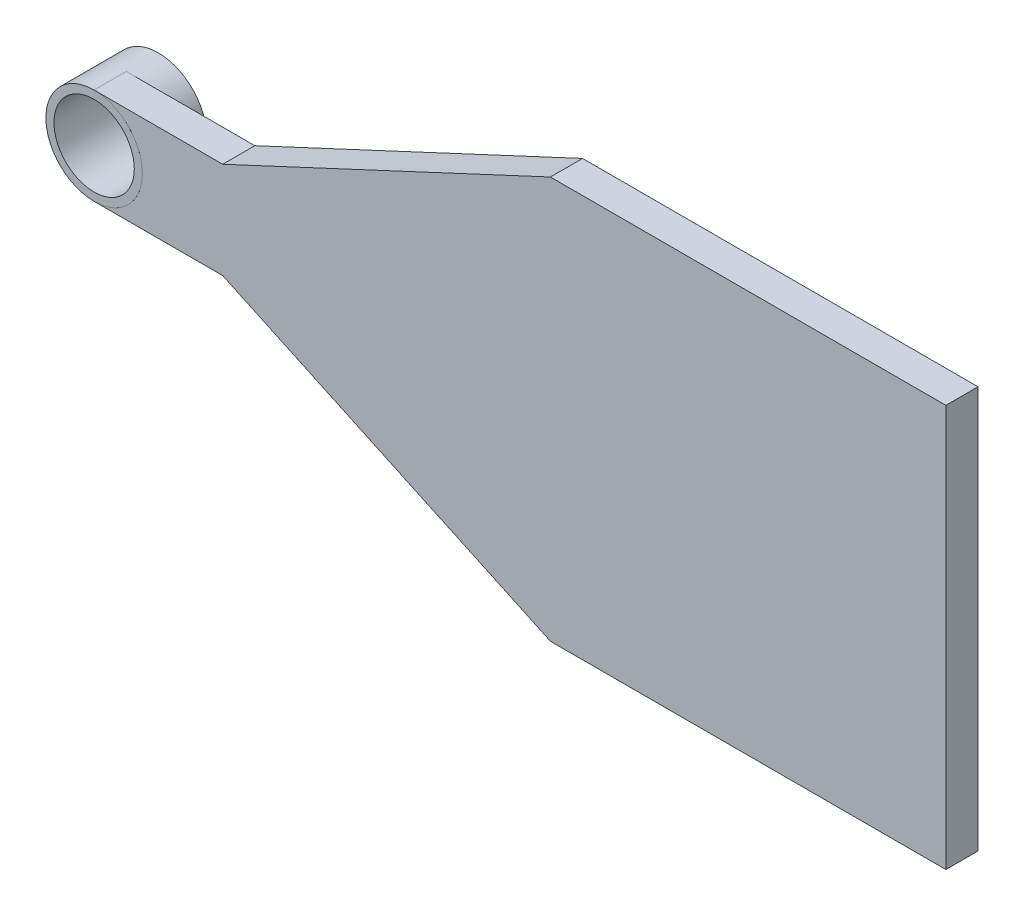
ISO-10303-21;
HEADER;
FILE_DESCRIPTION(('STEP AP214'),'2;1');
FILE_NAME('part.step','',(''),(''),'','','');
FILE_SCHEMA(('AUTOMOTIVE_DESIGN { 1 0 10303 214 1 1 1 1 }'));
ENDSEC;
DATA;
#1=APPLICATION_CONTEXT('core data for automotive mechanical design processes');
#2=APPLICATION_PROTOCOL_DEFINITION('international standard','automotive_design',2000,#1);
#3=PRODUCT_CONTEXT('',#1,'mechanical');
#4=PRODUCT('Part','Part','',(#3));
#5=PRODUCT_RELATED_PRODUCT_CATEGORY('part','',(#4));
#6=PRODUCT_DEFINITION_FORMATION('','',#4);
#7=PRODUCT_DEFINITION_CONTEXT('part definition',#1,'design');
#8=PRODUCT_DEFINITION('design','',#6,#7);
#9=PRODUCT_DEFINITION_SHAPE('','',#8);
#10=(LENGTH_UNIT() NAMED_UNIT(*) SI_UNIT(.MILLI.,.METRE.));
#11=(NAMED_UNIT(*) PLANE_ANGLE_UNIT() SI_UNIT($,.RADIAN.));
#12=(NAMED_UNIT(*) SI_UNIT($,.STERADIAN.) SOLID_ANGLE_UNIT());
#13=UNCERTAINTY_MEASURE_WITH_UNIT(LENGTH_MEASURE(1.E-05),#10,'distance_accuracy_value','');
#14=(GEOMETRIC_REPRESENTATION_CONTEXT(3) GLOBAL_UNCERTAINTY_ASSIGNED_CONTEXT((#13)) GLOBAL_UNIT_ASSIGNED_CONTEXT((#10,
#11,#12)) REPRESENTATION_CONTEXT('',''));
#15=CARTESIAN_POINT('',(0.,0.,0.));
#16=DIRECTION('',(0.,0.,1.));
#17=DIRECTION('',(1.,0.,0.));
#18=AXIS2_PLACEMENT_3D('',#15,#16,#17);
#19=CARTESIAN_POINT('',(16.,-6.,8.));
#20=DIRECTION('',(0.,0.,-1.));
#21=DIRECTION('',(-1.,0.,0.));
#22=AXIS2_PLACEMENT_3D('',#19,#20,#21);
#23=PLANE('',#22);
#24=DIRECTION('',(-1.,0.,0.));
#25=VECTOR('',#24,1.);
#26=CARTESIAN_POINT('',(16.,6.,8.));
#27=LINE('',#26,#25);
#28=CARTESIAN_POINT('',(16.,6.,8.00000000000001));
#29=VERTEX_POINT('',#28);
#30=CARTESIAN_POINT('',(0.,6.,8.));
#31=VERTEX_POINT('',#30);
#32=EDGE_CURVE('E159',#29,#31,#27,.T.);
#33=ORIENTED_EDGE('',*,*,#32,.T.);
#34=CARTESIAN_POINT('',(0.,0.,8.));
#35=DIRECTION('',(0.,0.,1.));
#36=DIRECTION('',(1.,0.,0.));
#37=AXIS2_PLACEMENT_3D('',#34,#35,#36);
#38=CIRCLE('',#37,6.);
#39=CARTESIAN_POINT('',(0.,-6.,8.));
#40=VERTEX_POINT('',#39);
#41=EDGE_CURVE('E152',#31,#40,#38,.F.);
#42=ORIENTED_EDGE('',*,*,#41,.T.);
#43=DIRECTION('',(-1.,0.,0.));
#44=VECTOR('',#43,1.);
#45=CARTESIAN_POINT('',(16.,-6.,8.));
#46=LINE('',#45,#44);
#47=CARTESIAN_POINT('',(16.,-6.,8.));
#48=VERTEX_POINT('',#47);
#49=EDGE_CURVE('E12',#48,#40,#46,.T.);
#50=ORIENTED_EDGE('',*,*,#49,.F.);
#51=DIRECTION('',(0.90630778703665,-0.4226182617407,0.));
#52=VECTOR('',#51,1.);
#53=CARTESIAN_POINT('',(16.,-6.,8.00000000000001));
#54=LINE('',#53,#52);
#55=CARTESIAN_POINT('',(56.7838504166492,-25.0178217783315,8.00000000000001));
#56=VERTEX_POINT('',#55);
#57=EDGE_CURVE('E128',#48,#56,#54,.T.);
#58=ORIENTED_EDGE('',*,*,#57,.T.);
#59=DIRECTION('',(1.,0.,0.));
#60=VECTOR('',#59,1.);
#61=CARTESIAN_POINT('',(106.,-25.0178217783315,8.00000000000001));
#62=LINE('',#61,#60);
#63=CARTESIAN_POINT('',(106.,-25.0178217783315,8.00000000000001));
#64=VERTEX_POINT('',#63);
#65=EDGE_CURVE('E176',#56,#64,#62,.T.);
#66=ORIENTED_EDGE('',*,*,#65,.T.);
#67=DIRECTION('',(0.,1.,0.));
#68=VECTOR('',#67,1.);
#69=CARTESIAN_POINT('',(106.,25.0178217783315,8.00000000000001));
#70=LINE('',#69,#68);
#71=CARTESIAN_POINT('',(106.,25.0178217783315,8.00000000000001));
#72=VERTEX_POINT('',#71);
#73=EDGE_CURVE('E174',#64,#72,#70,.T.);
#74=ORIENTED_EDGE('',*,*,#73,.T.);
#75=DIRECTION('',(-1.,0.,0.));
#76=VECTOR('',#75,1.);
#77=CARTESIAN_POINT('',(56.7838504166492,25.0178217783315,8.00000000000001));
#78=LINE('',#77,#76);
#79=CARTESIAN_POINT('',(56.7838504166492,25.0178217783315,8.00000000000001));
#80=VERTEX_POINT('',#79);
#81=EDGE_CURVE('E139',#72,#80,#78,.T.);
#82=ORIENTED_EDGE('',*,*,#81,.T.);
#83=DIRECTION('',(-0.90630778703665,-0.4226182617407,0.));
#84=VECTOR('',#83,1.);
#85=CARTESIAN_POINT('',(16.,6.,8.00000000000001));
#86=LINE('',#85,#84);
#87=EDGE_CURVE('E111',#80,#29,#86,.T.);
#88=ORIENTED_EDGE('',*,*,#87,.T.);
#89=EDGE_LOOP('',(#33,#42,#50,#58,#66,#74,#82,#88));
#90=FACE_BOUND('',#89,.T.);
#91=ADVANCED_FACE('F41',(#90),#23,.F.);
#92=CARTESIAN_POINT('',(16.,-6.,4.));
#93=DIRECTION('',(0.,1.,0.));
#94=DIRECTION('',(0.,0.,1.));
#95=AXIS2_PLACEMENT_3D('',#92,#93,#94);
#96=PLANE('',#95);
#97=ORIENTED_EDGE('',*,*,#49,.T.);
#98=DIRECTION('',(0.,0.,-1.));
#99=VECTOR('',#98,1.);
#100=CARTESIAN_POINT('',(0.,-6.,8.));
#101=LINE('',#100,#99);
#102=CARTESIAN_POINT('',(0.,-6.,4.));
#103=VERTEX_POINT('',#102);
#104=EDGE_CURVE('E144',#103,#40,#101,.F.);
#105=ORIENTED_EDGE('',*,*,#104,.F.);
#106=DIRECTION('',(-1.,0.,0.));
#107=VECTOR('',#106,1.);
#108=CARTESIAN_POINT('',(16.,-6.,4.));
#109=LINE('',#108,#107);
#110=CARTESIAN_POINT('',(16.,-6.,4.));
#111=VERTEX_POINT('',#110);
#112=EDGE_CURVE('E48',#111,#103,#109,.T.);
#113=ORIENTED_EDGE('',*,*,#112,.F.);
#114=DIRECTION('',(0.,0.,-1.));
#115=VECTOR('',#114,1.);
#116=CARTESIAN_POINT('',(16.,-6.,4.));
#117=LINE('',#116,#115);
#118=EDGE_CURVE('E155',#48,#111,#117,.T.);
#119=ORIENTED_EDGE('',*,*,#118,.F.);
#120=EDGE_LOOP('',(#97,#105,#113,#119));
#121=FACE_BOUND('',#120,.T.);
#122=ADVANCED_FACE('F167',(#121),#96,.F.);
#123=CARTESIAN_POINT('',(16.,-6.,4.));
#124=DIRECTION('',(0.,0.,1.));
#125=DIRECTION('',(1.,0.,0.));
#126=AXIS2_PLACEMENT_3D('',#123,#124,#125);
#127=PLANE('',#126);
#128=ORIENTED_EDGE('',*,*,#112,.T.);
#129=CARTESIAN_POINT('',(0.,0.,4.));
#130=DIRECTION('',(0.,0.,-1.));
#131=DIRECTION('',(-1.,0.,0.));
#132=AXIS2_PLACEMENT_3D('',#129,#130,#131);
#133=CIRCLE('',#132,6.);
#134=CARTESIAN_POINT('',(0.,6.,4.));
#135=VERTEX_POINT('',#134);
#136=EDGE_CURVE('E147',#103,#135,#133,.F.);
#137=ORIENTED_EDGE('',*,*,#136,.T.);
#138=DIRECTION('',(-1.,0.,0.));
#139=VECTOR('',#138,1.);
#140=CARTESIAN_POINT('',(16.,6.,4.));
#141=LINE('',#140,#139);
#142=CARTESIAN_POINT('',(16.,6.,4.));
#143=VERTEX_POINT('',#142);
#144=EDGE_CURVE('E55',#143,#135,#141,.T.);
#145=ORIENTED_EDGE('',*,*,#144,.F.);
#146=DIRECTION('',(0.90630778703665,0.4226182617407,0.));
#147=VECTOR('',#146,1.);
#148=CARTESIAN_POINT('',(16.,6.,4.));
#149=LINE('',#148,#147);
#150=CARTESIAN_POINT('',(56.7838504166492,25.0178217783315,4.));
#151=VERTEX_POINT('',#150);
#152=EDGE_CURVE('E109',#143,#151,#149,.T.);
#153=ORIENTED_EDGE('',*,*,#152,.T.);
#154=DIRECTION('',(1.,0.,0.));
#155=VECTOR('',#154,1.);
#156=CARTESIAN_POINT('',(56.7838504166492,25.0178217783315,4.));
#157=LINE('',#156,#155);
#158=CARTESIAN_POINT('',(106.,25.0178217783315,4.));
#159=VERTEX_POINT('',#158);
#160=EDGE_CURVE('E118',#151,#159,#157,.T.);
#161=ORIENTED_EDGE('',*,*,#160,.T.);
#162=DIRECTION('',(0.,-1.,0.));
#163=VECTOR('',#162,1.);
#164=CARTESIAN_POINT('',(106.,25.0178217783315,4.));
#165=LINE('',#164,#163);
#166=CARTESIAN_POINT('',(106.,-25.0178217783315,4.));
#167=VERTEX_POINT('',#166);
#168=EDGE_CURVE('E123',#159,#167,#165,.T.);
#169=ORIENTED_EDGE('',*,*,#168,.T.);
#170=DIRECTION('',(-1.,0.,0.));
#171=VECTOR('',#170,1.);
#172=CARTESIAN_POINT('',(106.,-25.0178217783315,4.));
#173=LINE('',#172,#171);
#174=CARTESIAN_POINT('',(56.7838504166492,-25.0178217783315,4.));
#175=VERTEX_POINT('',#174);
#176=EDGE_CURVE('E132',#167,#175,#173,.T.);
#177=ORIENTED_EDGE('',*,*,#176,.T.);
#178=DIRECTION('',(-0.906307787036649,0.4226182617407,0.));
#179=VECTOR('',#178,1.);
#180=CARTESIAN_POINT('',(16.,-6.,4.));
#181=LINE('',#180,#179);
#182=EDGE_CURVE('E115',#175,#111,#181,.T.);
#183=ORIENTED_EDGE('',*,*,#182,.T.);
#184=EDGE_LOOP('',(#128,#137,#145,#153,#161,#169,#177,#183));
#185=FACE_BOUND('',#184,.T.);
#186=ADVANCED_FACE('F125',(#185),#127,.F.);
#187=CARTESIAN_POINT('',(16.,6.,8.));
#188=DIRECTION('',(0.,-1.,0.));
#189=DIRECTION('',(0.,0.,-1.));
#190=AXIS2_PLACEMENT_3D('',#187,#188,#189);
#191=PLANE('',#190);
#192=ORIENTED_EDGE('',*,*,#144,.T.);
#193=DIRECTION('',(0.,0.,-1.));
#194=VECTOR('',#193,1.);
#195=CARTESIAN_POINT('',(0.,6.,8.00000000000001));
#196=LINE('',#195,#194);
#197=EDGE_CURVE('E149',#135,#31,#196,.F.);
#198=ORIENTED_EDGE('',*,*,#197,.T.);
#199=ORIENTED_EDGE('',*,*,#32,.F.);
#200=DIRECTION('',(0.,0.,1.));
#201=VECTOR('',#200,1.);
#202=CARTESIAN_POINT('',(16.,6.,8.));
#203=LINE('',#202,#201);
#204=EDGE_CURVE('E157',#143,#29,#203,.T.);
#205=ORIENTED_EDGE('',*,*,#204,.F.);
#206=EDGE_LOOP('',(#192,#198,#199,#205));
#207=FACE_BOUND('',#206,.T.);
#208=ADVANCED_FACE('F172',(#207),#191,.F.);
#209=CARTESIAN_POINT('',(0.,0.,8.));
#210=DIRECTION('',(0.,0.,-1.));
#211=DIRECTION('',(-1.,0.,0.));
#212=AXIS2_PLACEMENT_3D('',#209,#210,#211);
#213=CYLINDRICAL_SURFACE('',#212,6.);
#214=ORIENTED_EDGE('',*,*,#136,.F.);
#215=ORIENTED_EDGE('',*,*,#104,.T.);
#216=ORIENTED_EDGE('',*,*,#41,.F.);
#217=ORIENTED_EDGE('',*,*,#197,.F.);
#218=EDGE_LOOP('',(#214,#215,#216,#217));
#219=FACE_BOUND('',#218,.T.);
#220=ADVANCED_FACE('F165',(#219),#213,.F.);
#221=CARTESIAN_POINT('',(16.,-6.,110.973616165159));
#222=DIRECTION('',(-0.4226182617407,-0.90630778703665,0.));
#223=DIRECTION('',(0.90630778703665,-0.4226182617407,0.));
#224=AXIS2_PLACEMENT_3D('',#221,#222,#223);
#225=PLANE('',#224);
#226=ORIENTED_EDGE('',*,*,#57,.F.);
#227=ORIENTED_EDGE('',*,*,#118,.T.);
#228=ORIENTED_EDGE('',*,*,#182,.F.);
#229=DIRECTION('',(0.,0.,-1.));
#230=VECTOR('',#229,1.);
#231=CARTESIAN_POINT('',(56.7838504166492,-25.0178217783315,110.973616165159));
#232=LINE('',#231,#230);
#233=EDGE_CURVE('E137',#56,#175,#232,.T.);
#234=ORIENTED_EDGE('',*,*,#233,.F.);
#235=EDGE_LOOP('',(#226,#227,#228,#234));
#236=FACE_BOUND('',#235,.T.);
#237=ADVANCED_FACE('F185',(#236),#225,.T.);
#238=CARTESIAN_POINT('',(106.,-25.0178217783315,110.973616165159));
#239=DIRECTION('',(0.,-1.,0.));
#240=DIRECTION('',(0.,0.,-1.));
#241=AXIS2_PLACEMENT_3D('',#238,#239,#240);
#242=PLANE('',#241);
#243=ORIENTED_EDGE('',*,*,#65,.F.);
#244=ORIENTED_EDGE('',*,*,#233,.T.);
#245=ORIENTED_EDGE('',*,*,#176,.F.);
#246=DIRECTION('',(0.,0.,-1.));
#247=VECTOR('',#246,1.);
#248=CARTESIAN_POINT('',(106.,-25.0178217783315,110.973616165159));
#249=LINE('',#248,#247);
#250=EDGE_CURVE('E140',#64,#167,#249,.T.);
#251=ORIENTED_EDGE('',*,*,#250,.F.);
#252=EDGE_LOOP('',(#243,#244,#245,#251));
#253=FACE_BOUND('',#252,.T.);
#254=ADVANCED_FACE('F183',(#253),#242,.T.);
#255=CARTESIAN_POINT('',(106.,25.0178217783315,110.973616165159));
#256=DIRECTION('',(1.,0.,0.));
#257=DIRECTION('',(0.,0.,-1.));
#258=AXIS2_PLACEMENT_3D('',#255,#256,#257);
#259=PLANE('',#258);
#260=ORIENTED_EDGE('',*,*,#73,.F.);
#261=ORIENTED_EDGE('',*,*,#250,.T.);
#262=ORIENTED_EDGE('',*,*,#168,.F.);
#263=DIRECTION('',(0.,0.,-1.));
#264=VECTOR('',#263,1.);
#265=CARTESIAN_POINT('',(106.,25.0178217783315,110.973616165159));
#266=LINE('',#265,#264);
#267=EDGE_CURVE('E114',#72,#159,#266,.T.);
#268=ORIENTED_EDGE('',*,*,#267,.F.);
#269=EDGE_LOOP('',(#260,#261,#262,#268));
#270=FACE_BOUND('',#269,.T.);
#271=ADVANCED_FACE('F192',(#270),#259,.T.);
#272=CARTESIAN_POINT('',(56.7838504166492,25.0178217783315,110.973616165159));
#273=DIRECTION('',(0.,1.,0.));
#274=DIRECTION('',(-1.,0.,0.));
#275=AXIS2_PLACEMENT_3D('',#272,#273,#274);
#276=PLANE('',#275);
#277=ORIENTED_EDGE('',*,*,#81,.F.);
#278=ORIENTED_EDGE('',*,*,#267,.T.);
#279=ORIENTED_EDGE('',*,*,#160,.F.);
#280=DIRECTION('',(0.,0.,-1.));
#281=VECTOR('',#280,1.);
#282=CARTESIAN_POINT('',(56.7838504166492,25.0178217783315,110.973616165159));
#283=LINE('',#282,#281);
#284=EDGE_CURVE('E105',#80,#151,#283,.T.);
#285=ORIENTED_EDGE('',*,*,#284,.F.);
#286=EDGE_LOOP('',(#277,#278,#279,#285));
#287=FACE_BOUND('',#286,.T.);
#288=ADVANCED_FACE('F119',(#287),#276,.T.);
#289=CARTESIAN_POINT('',(16.,6.,110.973616165159));
#290=DIRECTION('',(-0.4226182617407,0.906307787036649,0.));
#291=DIRECTION('',(-0.90630778703665,-0.4226182617407,0.));
#292=AXIS2_PLACEMENT_3D('',#289,#290,#291);
#293=PLANE('',#292);
#294=ORIENTED_EDGE('',*,*,#87,.F.);
#295=ORIENTED_EDGE('',*,*,#284,.T.);
#296=ORIENTED_EDGE('',*,*,#152,.F.);
#297=ORIENTED_EDGE('',*,*,#204,.T.);
#298=EDGE_LOOP('',(#294,#295,#296,#297));
#299=FACE_BOUND('',#298,.T.);
#300=ADVANCED_FACE('F107',(#299),#293,.T.);
#301=CLOSED_SHELL('',(#91,#122,#186,#208,#220,#237,#254,#271,#288,#300));
#302=MANIFOLD_SOLID_BREP('B2',#301);
#303=CARTESIAN_POINT('',(0.,0.,8.));
#304=DIRECTION('',(0.,0.,1.));
#305=DIRECTION('',(1.,0.,0.));
#306=AXIS2_PLACEMENT_3D('',#303,#304,#305);
#307=PLANE('',#306);
#308=CARTESIAN_POINT('',(0.,0.,8.));
#309=DIRECTION('',(0.,0.,1.));
#310=DIRECTION('',(1.,0.,0.));
#311=AXIS2_PLACEMENT_3D('',#308,#309,#310);
#312=CIRCLE('',#311,6.);
#313=CARTESIAN_POINT('',(6.,0.,8.));
#314=VERTEX_POINT('',#313);
#315=EDGE_CURVE('E40',#314,#314,#312,.T.);
#316=ORIENTED_EDGE('',*,*,#315,.T.);
#317=EDGE_LOOP('',(#316));
#318=FACE_BOUND('',#317,.T.);
#319=CARTESIAN_POINT('',(0.,0.,8.));
#320=DIRECTION('',(0.,0.,1.));
#321=DIRECTION('',(1.,0.,0.));
#322=AXIS2_PLACEMENT_3D('',#319,#320,#321);
#323=CIRCLE('',#322,5.);
#324=CARTESIAN_POINT('',(5.,0.,8.));
#325=VERTEX_POINT('',#324);
#326=EDGE_CURVE('E289',#325,#325,#323,.T.);
#327=ORIENTED_EDGE('',*,*,#326,.F.);
#328=EDGE_LOOP('',(#327));
#329=FACE_BOUND('',#328,.T.);
#330=ADVANCED_FACE('F278',(#318,#329),#307,.T.);
#331=CARTESIAN_POINT('',(0.,0.,0.));
#332=DIRECTION('',(0.,0.,1.));
#333=DIRECTION('',(1.,0.,0.));
#334=AXIS2_PLACEMENT_3D('',#331,#332,#333);
#335=PLANE('',#334);
#336=CARTESIAN_POINT('',(0.,0.,0.));
#337=DIRECTION('',(0.,0.,1.));
#338=DIRECTION('',(1.,0.,0.));
#339=AXIS2_PLACEMENT_3D('',#336,#337,#338);
#340=CIRCLE('',#339,6.);
#341=CARTESIAN_POINT('',(6.,0.,0.));
#342=VERTEX_POINT('',#341);
#343=EDGE_CURVE('E282',#342,#342,#340,.T.);
#344=ORIENTED_EDGE('',*,*,#343,.F.);
#345=EDGE_LOOP('',(#344));
#346=FACE_BOUND('',#345,.T.);
#347=CARTESIAN_POINT('',(0.,0.,0.));
#348=DIRECTION('',(0.,0.,1.));
#349=DIRECTION('',(1.,0.,0.));
#350=AXIS2_PLACEMENT_3D('',#347,#348,#349);
#351=CIRCLE('',#350,5.);
#352=CARTESIAN_POINT('',(5.,0.,0.));
#353=VERTEX_POINT('',#352);
#354=EDGE_CURVE('E291',#353,#353,#351,.T.);
#355=ORIENTED_EDGE('',*,*,#354,.T.);
#356=EDGE_LOOP('',(#355));
#357=FACE_BOUND('',#356,.T.);
#358=ADVANCED_FACE('F301',(#346,#357),#335,.F.);
#359=CARTESIAN_POINT('',(0.,0.,8.));
#360=DIRECTION('',(0.,0.,-1.));
#361=DIRECTION('',(-1.,0.,0.));
#362=AXIS2_PLACEMENT_3D('',#359,#360,#361);
#363=CYLINDRICAL_SURFACE('',#362,6.);
#364=ORIENTED_EDGE('',*,*,#315,.F.);
#365=EDGE_LOOP('',(#364));
#366=FACE_BOUND('',#365,.T.);
#367=ORIENTED_EDGE('',*,*,#343,.T.);
#368=EDGE_LOOP('',(#367));
#369=FACE_BOUND('',#368,.T.);
#370=ADVANCED_FACE('F280',(#366,#369),#363,.T.);
#371=CARTESIAN_POINT('',(0.,0.,8.));
#372=DIRECTION('',(0.,0.,-1.));
#373=DIRECTION('',(-1.,0.,0.));
#374=AXIS2_PLACEMENT_3D('',#371,#372,#373);
#375=CYLINDRICAL_SURFACE('',#374,5.);
#376=ORIENTED_EDGE('',*,*,#326,.T.);
#377=EDGE_LOOP('',(#376));
#378=FACE_BOUND('',#377,.T.);
#379=ORIENTED_EDGE('',*,*,#354,.F.);
#380=EDGE_LOOP('',(#379));
#381=FACE_BOUND('',#380,.T.);
#382=ADVANCED_FACE('F297',(#378,#381),#375,.F.);
#383=CLOSED_SHELL('',(#330,#358,#370,#382));
#384=MANIFOLD_SOLID_BREP('B6',#383);
#385=ADVANCED_BREP_SHAPE_REPRESENTATION('',(#18,#302,#384),#14);
#386=SHAPE_DEFINITION_REPRESENTATION(#9,#385);
ENDSEC;
END-ISO-10303-21;
